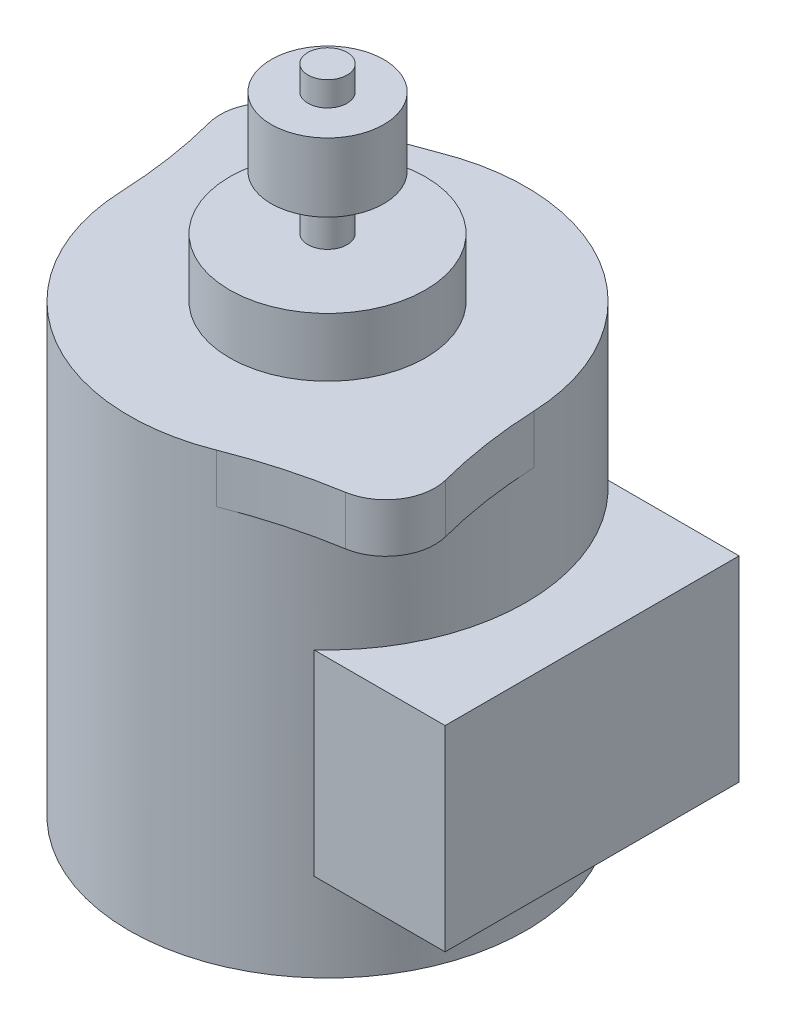
ISO-10303-21;
HEADER;
FILE_DESCRIPTION(('STEP AP214'),'2;1');
FILE_NAME('part.step','',(''),(''),'','','');
FILE_SCHEMA(('AUTOMOTIVE_DESIGN { 1 0 10303 214 1 1 1 1 }'));
ENDSEC;
DATA;
#1=APPLICATION_CONTEXT('core data for automotive mechanical design processes');
#2=APPLICATION_PROTOCOL_DEFINITION('international standard','automotive_design',2000,#1);
#3=PRODUCT_CONTEXT('',#1,'mechanical');
#4=PRODUCT('Part','Part','',(#3));
#5=PRODUCT_RELATED_PRODUCT_CATEGORY('part','',(#4));
#6=PRODUCT_DEFINITION_FORMATION('','',#4);
#7=PRODUCT_DEFINITION_CONTEXT('part definition',#1,'design');
#8=PRODUCT_DEFINITION('design','',#6,#7);
#9=PRODUCT_DEFINITION_SHAPE('','',#8);
#10=(LENGTH_UNIT() NAMED_UNIT(*) SI_UNIT(.MILLI.,.METRE.));
#11=(NAMED_UNIT(*) PLANE_ANGLE_UNIT() SI_UNIT($,.RADIAN.));
#12=(NAMED_UNIT(*) SI_UNIT($,.STERADIAN.) SOLID_ANGLE_UNIT());
#13=UNCERTAINTY_MEASURE_WITH_UNIT(LENGTH_MEASURE(1.E-05),#10,'distance_accuracy_value','');
#14=(GEOMETRIC_REPRESENTATION_CONTEXT(3) GLOBAL_UNCERTAINTY_ASSIGNED_CONTEXT((#13)) GLOBAL_UNIT_ASSIGNED_CONTEXT((#10,
#11,#12)) REPRESENTATION_CONTEXT('',''));
#15=CARTESIAN_POINT('',(0.,0.,0.));
#16=DIRECTION('',(0.,0.,1.));
#17=DIRECTION('',(1.,0.,0.));
#18=AXIS2_PLACEMENT_3D('',#15,#16,#17);
#19=CARTESIAN_POINT('',(0.,13.3,0.));
#20=DIRECTION('',(0.,-1.,0.));
#21=DIRECTION('',(0.,0.,-1.));
#22=AXIS2_PLACEMENT_3D('',#19,#20,#21);
#23=CYLINDRICAL_SURFACE('',#22,0.4);
#24=CARTESIAN_POINT('',(0.,10.3,0.));
#25=DIRECTION('',(0.,1.,0.));
#26=DIRECTION('',(0.,0.,1.));
#27=AXIS2_PLACEMENT_3D('',#24,#25,#26);
#28=CIRCLE('',#27,0.4);
#29=CARTESIAN_POINT('',(0.,10.3,0.4));
#30=VERTEX_POINT('',#29);
#31=EDGE_CURVE('E42',#30,#30,#28,.T.);
#32=ORIENTED_EDGE('',*,*,#31,.T.);
#33=EDGE_LOOP('',(#32));
#34=FACE_BOUND('',#33,.T.);
#35=CARTESIAN_POINT('',(0.,11.4,0.));
#36=DIRECTION('',(0.,1.,0.));
#37=DIRECTION('',(0.,0.,1.));
#38=AXIS2_PLACEMENT_3D('',#35,#36,#37);
#39=CIRCLE('',#38,0.4);
#40=CARTESIAN_POINT('',(0.,11.4,0.4));
#41=VERTEX_POINT('',#40);
#42=EDGE_CURVE('E11',#41,#41,#39,.T.);
#43=ORIENTED_EDGE('',*,*,#42,.F.);
#44=EDGE_LOOP('',(#43));
#45=FACE_BOUND('',#44,.T.);
#46=ADVANCED_FACE('F34',(#34,#45),#23,.T.);
#47=CARTESIAN_POINT('',(0.,8.1,0.));
#48=DIRECTION('',(0.,-1.,0.));
#49=DIRECTION('',(0.,0.,-1.));
#50=AXIS2_PLACEMENT_3D('',#47,#48,#49);
#51=CYLINDRICAL_SURFACE('',#50,4.05);
#52=DIRECTION('',(0.,-1.,0.));
#53=VECTOR('',#52,1.);
#54=CARTESIAN_POINT('',(2.72075357208256,8.1,3.));
#55=LINE('',#54,#53);
#56=CARTESIAN_POINT('',(2.72075357208256,5.8,3.));
#57=VERTEX_POINT('',#56);
#58=CARTESIAN_POINT('',(2.72075357208256,1.8,3.));
#59=VERTEX_POINT('',#58);
#60=EDGE_CURVE('E149',#57,#59,#55,.T.);
#61=ORIENTED_EDGE('',*,*,#60,.F.);
#62=CARTESIAN_POINT('',(0.,5.8,0.));
#63=DIRECTION('',(0.,1.,0.));
#64=DIRECTION('',(0.,0.,1.));
#65=AXIS2_PLACEMENT_3D('',#62,#63,#64);
#66=CIRCLE('',#65,4.05);
#67=CARTESIAN_POINT('',(2.72075357208256,5.8,-3.));
#68=VERTEX_POINT('',#67);
#69=EDGE_CURVE('E135',#68,#57,#66,.F.);
#70=ORIENTED_EDGE('',*,*,#69,.F.);
#71=DIRECTION('',(0.,-1.,0.));
#72=VECTOR('',#71,1.);
#73=CARTESIAN_POINT('',(2.72075357208256,8.1,-3.));
#74=LINE('',#73,#72);
#75=CARTESIAN_POINT('',(2.72075357208256,1.8,-3.));
#76=VERTEX_POINT('',#75);
#77=EDGE_CURVE('E125',#76,#68,#74,.F.);
#78=ORIENTED_EDGE('',*,*,#77,.F.);
#79=CARTESIAN_POINT('',(0.,1.8,0.));
#80=DIRECTION('',(0.,-1.,0.));
#81=DIRECTION('',(0.,0.,-1.));
#82=AXIS2_PLACEMENT_3D('',#79,#80,#81);
#83=CIRCLE('',#82,4.05);
#84=EDGE_CURVE('E144',#59,#76,#83,.F.);
#85=ORIENTED_EDGE('',*,*,#84,.F.);
#86=EDGE_LOOP('',(#61,#70,#78,#85));
#87=FACE_BOUND('',#86,.T.);
#88=CARTESIAN_POINT('',(0.,8.1,0.));
#89=DIRECTION('',(0.,1.,0.));
#90=DIRECTION('',(0.,0.,1.));
#91=AXIS2_PLACEMENT_3D('',#88,#89,#90);
#92=CIRCLE('',#91,4.05);
#93=CARTESIAN_POINT('',(1.49315454505589,8.1,3.76470310975234));
#94=VERTEX_POINT('',#93);
#95=CARTESIAN_POINT('',(4.04654809253663,8.1,-0.167178152843471));
#96=VERTEX_POINT('',#95);
#97=EDGE_CURVE('E192',#94,#96,#92,.T.);
#98=ORIENTED_EDGE('',*,*,#97,.F.);
#99=DIRECTION('',(0.,-1.,0.));
#100=VECTOR('',#99,1.);
#101=CARTESIAN_POINT('',(1.49315454505589,8.1,3.76470310975234));
#102=LINE('',#101,#100);
#103=CARTESIAN_POINT('',(1.49315454505589,9.1,3.76470310975234));
#104=VERTEX_POINT('',#103);
#105=EDGE_CURVE('E210',#94,#104,#102,.F.);
#106=ORIENTED_EDGE('',*,*,#105,.T.);
#107=CARTESIAN_POINT('',(0.,9.1,0.));
#108=DIRECTION('',(0.,1.,0.));
#109=DIRECTION('',(0.,0.,1.));
#110=AXIS2_PLACEMENT_3D('',#107,#108,#109);
#111=CIRCLE('',#110,4.05);
#112=CARTESIAN_POINT('',(-4.04654809253663,9.1,0.167178152843468));
#113=VERTEX_POINT('',#112);
#114=EDGE_CURVE('E178',#113,#104,#111,.T.);
#115=ORIENTED_EDGE('',*,*,#114,.F.);
#116=DIRECTION('',(0.,-1.,0.));
#117=VECTOR('',#116,1.);
#118=CARTESIAN_POINT('',(-4.04654809253663,8.1,0.167178152843468));
#119=LINE('',#118,#117);
#120=CARTESIAN_POINT('',(-4.04654809253663,8.1,0.167178152843468));
#121=VERTEX_POINT('',#120);
#122=EDGE_CURVE('E202',#113,#121,#119,.T.);
#123=ORIENTED_EDGE('',*,*,#122,.T.);
#124=CARTESIAN_POINT('',(-1.49315454505589,8.1,-3.76470310975234));
#125=VERTEX_POINT('',#124);
#126=EDGE_CURVE('E195',#125,#121,#92,.T.);
#127=ORIENTED_EDGE('',*,*,#126,.F.);
#128=DIRECTION('',(0.,-1.,0.));
#129=VECTOR('',#128,1.);
#130=CARTESIAN_POINT('',(-1.49315454505589,8.1,-3.76470310975234));
#131=LINE('',#130,#129);
#132=CARTESIAN_POINT('',(-1.49315454505589,9.1,-3.76470310975234));
#133=VERTEX_POINT('',#132);
#134=EDGE_CURVE('E205',#125,#133,#131,.F.);
#135=ORIENTED_EDGE('',*,*,#134,.T.);
#136=CARTESIAN_POINT('',(0.,9.1,0.));
#137=DIRECTION('',(0.,1.,0.));
#138=DIRECTION('',(0.,0.,1.));
#139=AXIS2_PLACEMENT_3D('',#136,#137,#138);
#140=CIRCLE('',#139,4.05);
#141=CARTESIAN_POINT('',(4.04654809253663,9.1,-0.167178152843471));
#142=VERTEX_POINT('',#141);
#143=EDGE_CURVE('E185',#142,#133,#140,.T.);
#144=ORIENTED_EDGE('',*,*,#143,.F.);
#145=DIRECTION('',(0.,-1.,0.));
#146=VECTOR('',#145,1.);
#147=CARTESIAN_POINT('',(4.04654809253663,8.1,-0.167178152843471));
#148=LINE('',#147,#146);
#149=EDGE_CURVE('E207',#142,#96,#148,.T.);
#150=ORIENTED_EDGE('',*,*,#149,.T.);
#151=EDGE_LOOP('',(#98,#106,#115,#123,#127,#135,#144,#150));
#152=FACE_BOUND('',#151,.T.);
#153=CARTESIAN_POINT('',(0.,0.,0.));
#154=DIRECTION('',(0.,1.,0.));
#155=DIRECTION('',(0.,0.,1.));
#156=AXIS2_PLACEMENT_3D('',#153,#154,#155);
#157=CIRCLE('',#156,4.05);
#158=CARTESIAN_POINT('',(0.,0.,4.05));
#159=VERTEX_POINT('',#158);
#160=EDGE_CURVE('E188',#159,#159,#157,.T.);
#161=ORIENTED_EDGE('',*,*,#160,.T.);
#162=EDGE_LOOP('',(#161));
#163=FACE_BOUND('',#162,.T.);
#164=ADVANCED_FACE('F147',(#87,#152,#163),#51,.T.);
#165=CARTESIAN_POINT('',(0.,0.,0.));
#166=DIRECTION('',(0.,1.,0.));
#167=DIRECTION('',(0.,0.,1.));
#168=AXIS2_PLACEMENT_3D('',#165,#166,#167);
#169=PLANE('',#168);
#170=ORIENTED_EDGE('',*,*,#160,.F.);
#171=EDGE_LOOP('',(#170));
#172=FACE_BOUND('',#171,.T.);
#173=ADVANCED_FACE('F267',(#172),#169,.F.);
#174=CARTESIAN_POINT('',(-1.69830790008948,8.1,-1.10289404590543));
#175=DIRECTION('',(0.,1.,0.));
#176=DIRECTION('',(0.,0.,1.));
#177=AXIS2_PLACEMENT_3D('',#174,#175,#176);
#178=PLANE('',#177);
#179=CARTESIAN_POINT('',(3.39661580017897,8.1,2.20578809181086));
#180=DIRECTION('',(0.,1.,0.));
#181=DIRECTION('',(0.,0.,1.));
#182=AXIS2_PLACEMENT_3D('',#179,#180,#181);
#183=CIRCLE('',#182,1.);
#184=CARTESIAN_POINT('',(3.55873762660569,8.1,3.1925588419834));
#185=VERTEX_POINT('',#184);
#186=CARTESIAN_POINT('',(4.36401662418379,8.1,1.95253792751715));
#187=VERTEX_POINT('',#186);
#188=EDGE_CURVE('E179',#185,#187,#183,.T.);
#189=ORIENTED_EDGE('',*,*,#188,.F.);
#190=CARTESIAN_POINT('',(5.17995589087291,8.1,13.0602663437087));
#191=DIRECTION('',(0.,1.,0.));
#192=DIRECTION('',(0.,0.,1.));
#193=AXIS2_PLACEMENT_3D('',#190,#191,#192);
#194=CIRCLE('',#193,10.);
#195=EDGE_CURVE('E216',#185,#94,#194,.T.);
#196=ORIENTED_EDGE('',*,*,#195,.T.);
#197=ORIENTED_EDGE('',*,*,#97,.T.);
#198=CARTESIAN_POINT('',(14.038024864232,8.1,-0.579963715419942));
#199=DIRECTION('',(0.,1.,0.));
#200=DIRECTION('',(0.,0.,1.));
#201=AXIS2_PLACEMENT_3D('',#198,#199,#200);
#202=CIRCLE('',#201,10.);
#203=EDGE_CURVE('E221',#96,#187,#202,.T.);
#204=ORIENTED_EDGE('',*,*,#203,.T.);
#205=EDGE_LOOP('',(#189,#196,#197,#204));
#206=FACE_BOUND('',#205,.T.);
#207=ADVANCED_FACE('F427',(#206),#178,.F.);
#208=CARTESIAN_POINT('',(-3.39661580017897,9.1,-2.20578809181086));
#209=DIRECTION('',(0.,-1.,0.));
#210=DIRECTION('',(0.,0.,-1.));
#211=AXIS2_PLACEMENT_3D('',#208,#209,#210);
#212=CYLINDRICAL_SURFACE('',#211,1.);
#213=CARTESIAN_POINT('',(-3.39661580017897,9.1,-2.20578809181086));
#214=DIRECTION('',(0.,1.,0.));
#215=DIRECTION('',(0.,0.,1.));
#216=AXIS2_PLACEMENT_3D('',#213,#214,#215);
#217=CIRCLE('',#216,1.);
#218=CARTESIAN_POINT('',(-3.55873762660569,9.1,-3.1925588419834));
#219=VERTEX_POINT('',#218);
#220=CARTESIAN_POINT('',(-4.36401662418379,9.1,-1.95253792751716));
#221=VERTEX_POINT('',#220);
#222=EDGE_CURVE('E176',#219,#221,#217,.T.);
#223=ORIENTED_EDGE('',*,*,#222,.F.);
#224=DIRECTION('',(0.,-1.,0.));
#225=VECTOR('',#224,1.);
#226=CARTESIAN_POINT('',(-3.55873762660569,9.1,-3.1925588419834));
#227=LINE('',#226,#225);
#228=CARTESIAN_POINT('',(-3.55873762660569,8.1,-3.1925588419834));
#229=VERTEX_POINT('',#228);
#230=EDGE_CURVE('E213',#219,#229,#227,.T.);
#231=ORIENTED_EDGE('',*,*,#230,.T.);
#232=CARTESIAN_POINT('',(-3.39661580017897,8.1,-2.20578809181086));
#233=DIRECTION('',(0.,1.,0.));
#234=DIRECTION('',(0.,0.,1.));
#235=AXIS2_PLACEMENT_3D('',#232,#233,#234);
#236=CIRCLE('',#235,1.);
#237=CARTESIAN_POINT('',(-4.36401662418379,8.1,-1.95253792751716));
#238=VERTEX_POINT('',#237);
#239=EDGE_CURVE('E172',#229,#238,#236,.T.);
#240=ORIENTED_EDGE('',*,*,#239,.T.);
#241=DIRECTION('',(0.,-1.,0.));
#242=VECTOR('',#241,1.);
#243=CARTESIAN_POINT('',(-4.36401662418379,9.1,-1.95253792751716));
#244=LINE('',#243,#242);
#245=EDGE_CURVE('E57',#238,#221,#244,.F.);
#246=ORIENTED_EDGE('',*,*,#245,.T.);
#247=EDGE_LOOP('',(#223,#231,#240,#246));
#248=FACE_BOUND('',#247,.T.);
#249=ADVANCED_FACE('F433',(#248),#212,.T.);
#250=CARTESIAN_POINT('',(3.39661580017897,9.1,2.20578809181086));
#251=DIRECTION('',(0.,-1.,0.));
#252=DIRECTION('',(0.,0.,-1.));
#253=AXIS2_PLACEMENT_3D('',#250,#251,#252);
#254=CYLINDRICAL_SURFACE('',#253,1.);
#255=CARTESIAN_POINT('',(3.39661580017897,9.1,2.20578809181086));
#256=DIRECTION('',(0.,1.,0.));
#257=DIRECTION('',(0.,0.,1.));
#258=AXIS2_PLACEMENT_3D('',#255,#256,#257);
#259=CIRCLE('',#258,1.);
#260=CARTESIAN_POINT('',(3.55873762660569,9.1,3.1925588419834));
#261=VERTEX_POINT('',#260);
#262=CARTESIAN_POINT('',(4.36401662418379,9.1,1.95253792751715));
#263=VERTEX_POINT('',#262);
#264=EDGE_CURVE('E182',#261,#263,#259,.T.);
#265=ORIENTED_EDGE('',*,*,#264,.F.);
#266=DIRECTION('',(0.,-1.,0.));
#267=VECTOR('',#266,1.);
#268=CARTESIAN_POINT('',(3.55873762660569,9.1,3.1925588419834));
#269=LINE('',#268,#267);
#270=EDGE_CURVE('E199',#261,#185,#269,.T.);
#271=ORIENTED_EDGE('',*,*,#270,.T.);
#272=ORIENTED_EDGE('',*,*,#188,.T.);
#273=DIRECTION('',(0.,-1.,0.));
#274=VECTOR('',#273,1.);
#275=CARTESIAN_POINT('',(4.36401662418379,9.1,1.95253792751715));
#276=LINE('',#275,#274);
#277=EDGE_CURVE('E194',#187,#263,#276,.F.);
#278=ORIENTED_EDGE('',*,*,#277,.T.);
#279=EDGE_LOOP('',(#265,#271,#272,#278));
#280=FACE_BOUND('',#279,.T.);
#281=ADVANCED_FACE('F378',(#280),#254,.T.);
#282=CARTESIAN_POINT('',(-1.69830790008948,9.1,-1.10289404590543));
#283=DIRECTION('',(0.,1.,0.));
#284=DIRECTION('',(0.,0.,1.));
#285=AXIS2_PLACEMENT_3D('',#282,#283,#284);
#286=PLANE('',#285);
#287=CARTESIAN_POINT('',(0.,9.1,0.));
#288=DIRECTION('',(0.,1.,0.));
#289=DIRECTION('',(0.,0.,1.));
#290=AXIS2_PLACEMENT_3D('',#287,#288,#289);
#291=CIRCLE('',#290,2.);
#292=CARTESIAN_POINT('',(0.,9.1,2.));
#293=VERTEX_POINT('',#292);
#294=EDGE_CURVE('E169',#293,#293,#291,.T.);
#295=ORIENTED_EDGE('',*,*,#294,.F.);
#296=EDGE_LOOP('',(#295));
#297=FACE_BOUND('',#296,.T.);
#298=ORIENTED_EDGE('',*,*,#143,.T.);
#299=CARTESIAN_POINT('',(-5.17995589087291,9.1,-13.0602663437087));
#300=DIRECTION('',(0.,1.,0.));
#301=DIRECTION('',(0.,0.,1.));
#302=AXIS2_PLACEMENT_3D('',#299,#300,#301);
#303=CIRCLE('',#302,10.);
#304=EDGE_CURVE('E228',#133,#219,#303,.F.);
#305=ORIENTED_EDGE('',*,*,#304,.T.);
#306=ORIENTED_EDGE('',*,*,#222,.T.);
#307=CARTESIAN_POINT('',(-14.038024864232,9.1,0.579963715419932));
#308=DIRECTION('',(0.,1.,0.));
#309=DIRECTION('',(0.,0.,1.));
#310=AXIS2_PLACEMENT_3D('',#307,#308,#309);
#311=CIRCLE('',#310,10.);
#312=EDGE_CURVE('E175',#221,#113,#311,.F.);
#313=ORIENTED_EDGE('',*,*,#312,.T.);
#314=ORIENTED_EDGE('',*,*,#114,.T.);
#315=CARTESIAN_POINT('',(5.17995589087291,9.1,13.0602663437087));
#316=DIRECTION('',(0.,1.,0.));
#317=DIRECTION('',(0.,0.,1.));
#318=AXIS2_PLACEMENT_3D('',#315,#316,#317);
#319=CIRCLE('',#318,10.);
#320=EDGE_CURVE('E219',#104,#261,#319,.F.);
#321=ORIENTED_EDGE('',*,*,#320,.T.);
#322=ORIENTED_EDGE('',*,*,#264,.T.);
#323=CARTESIAN_POINT('',(14.038024864232,9.1,-0.579963715419942));
#324=DIRECTION('',(0.,1.,0.));
#325=DIRECTION('',(0.,0.,1.));
#326=AXIS2_PLACEMENT_3D('',#323,#324,#325);
#327=CIRCLE('',#326,10.);
#328=EDGE_CURVE('E223',#263,#142,#327,.F.);
#329=ORIENTED_EDGE('',*,*,#328,.T.);
#330=EDGE_LOOP('',(#298,#305,#306,#313,#314,#321,#322,#329));
#331=FACE_BOUND('',#330,.T.);
#332=ADVANCED_FACE('F372',(#297,#331),#286,.T.);
#333=ORIENTED_EDGE('',*,*,#239,.F.);
#334=CARTESIAN_POINT('',(-5.17995589087291,8.1,-13.0602663437087));
#335=DIRECTION('',(0.,1.,0.));
#336=DIRECTION('',(0.,0.,1.));
#337=AXIS2_PLACEMENT_3D('',#334,#335,#336);
#338=CIRCLE('',#337,10.);
#339=EDGE_CURVE('E225',#229,#125,#338,.T.);
#340=ORIENTED_EDGE('',*,*,#339,.T.);
#341=ORIENTED_EDGE('',*,*,#126,.T.);
#342=CARTESIAN_POINT('',(-14.038024864232,8.1,0.579963715419932));
#343=DIRECTION('',(0.,1.,0.));
#344=DIRECTION('',(0.,0.,1.));
#345=AXIS2_PLACEMENT_3D('',#342,#343,#344);
#346=CIRCLE('',#345,10.);
#347=EDGE_CURVE('E230',#121,#238,#346,.T.);
#348=ORIENTED_EDGE('',*,*,#347,.T.);
#349=EDGE_LOOP('',(#333,#340,#341,#348));
#350=FACE_BOUND('',#349,.T.);
#351=ADVANCED_FACE('F377',(#350),#178,.F.);
#352=CARTESIAN_POINT('',(5.17995589087291,8.1,13.0602663437087));
#353=DIRECTION('',(0.,1.,0.));
#354=DIRECTION('',(0.,0.,1.));
#355=AXIS2_PLACEMENT_3D('',#352,#353,#354);
#356=CYLINDRICAL_SURFACE('',#355,10.);
#357=ORIENTED_EDGE('',*,*,#320,.F.);
#358=ORIENTED_EDGE('',*,*,#105,.F.);
#359=ORIENTED_EDGE('',*,*,#195,.F.);
#360=ORIENTED_EDGE('',*,*,#270,.F.);
#361=EDGE_LOOP('',(#357,#358,#359,#360));
#362=FACE_BOUND('',#361,.T.);
#363=ADVANCED_FACE('F408',(#362),#356,.F.);
#364=CARTESIAN_POINT('',(14.038024864232,9.1,-0.579963715419942));
#365=DIRECTION('',(0.,1.,0.));
#366=DIRECTION('',(0.,0.,1.));
#367=AXIS2_PLACEMENT_3D('',#364,#365,#366);
#368=CYLINDRICAL_SURFACE('',#367,10.);
#369=ORIENTED_EDGE('',*,*,#328,.F.);
#370=ORIENTED_EDGE('',*,*,#277,.F.);
#371=ORIENTED_EDGE('',*,*,#203,.F.);
#372=ORIENTED_EDGE('',*,*,#149,.F.);
#373=EDGE_LOOP('',(#369,#370,#371,#372));
#374=FACE_BOUND('',#373,.T.);
#375=ADVANCED_FACE('F399',(#374),#368,.F.);
#376=CARTESIAN_POINT('',(-5.17995589087291,8.1,-13.0602663437087));
#377=DIRECTION('',(0.,1.,0.));
#378=DIRECTION('',(0.,0.,1.));
#379=AXIS2_PLACEMENT_3D('',#376,#377,#378);
#380=CYLINDRICAL_SURFACE('',#379,10.);
#381=ORIENTED_EDGE('',*,*,#304,.F.);
#382=ORIENTED_EDGE('',*,*,#134,.F.);
#383=ORIENTED_EDGE('',*,*,#339,.F.);
#384=ORIENTED_EDGE('',*,*,#230,.F.);
#385=EDGE_LOOP('',(#381,#382,#383,#384));
#386=FACE_BOUND('',#385,.T.);
#387=ADVANCED_FACE('F390',(#386),#380,.F.);
#388=CARTESIAN_POINT('',(-14.038024864232,9.1,0.579963715419932));
#389=DIRECTION('',(0.,1.,0.));
#390=DIRECTION('',(0.,0.,1.));
#391=AXIS2_PLACEMENT_3D('',#388,#389,#390);
#392=CYLINDRICAL_SURFACE('',#391,10.);
#393=ORIENTED_EDGE('',*,*,#312,.F.);
#394=ORIENTED_EDGE('',*,*,#245,.F.);
#395=ORIENTED_EDGE('',*,*,#347,.F.);
#396=ORIENTED_EDGE('',*,*,#122,.F.);
#397=EDGE_LOOP('',(#393,#394,#395,#396));
#398=FACE_BOUND('',#397,.T.);
#399=ADVANCED_FACE('F36',(#398),#392,.F.);
#400=CARTESIAN_POINT('',(0.,10.3,0.));
#401=DIRECTION('',(0.,-1.,0.));
#402=DIRECTION('',(0.,0.,-1.));
#403=AXIS2_PLACEMENT_3D('',#400,#401,#402);
#404=CYLINDRICAL_SURFACE('',#403,2.);
#405=CARTESIAN_POINT('',(0.,10.3,0.));
#406=DIRECTION('',(0.,1.,0.));
#407=DIRECTION('',(0.,0.,1.));
#408=AXIS2_PLACEMENT_3D('',#405,#406,#407);
#409=CIRCLE('',#408,2.);
#410=CARTESIAN_POINT('',(0.,10.3,2.));
#411=VERTEX_POINT('',#410);
#412=EDGE_CURVE('E166',#411,#411,#409,.T.);
#413=ORIENTED_EDGE('',*,*,#412,.F.);
#414=EDGE_LOOP('',(#413));
#415=FACE_BOUND('',#414,.T.);
#416=ORIENTED_EDGE('',*,*,#294,.T.);
#417=EDGE_LOOP('',(#416));
#418=FACE_BOUND('',#417,.T.);
#419=ADVANCED_FACE('F257',(#415,#418),#404,.T.);
#420=CARTESIAN_POINT('',(0.,10.3,0.));
#421=DIRECTION('',(0.,1.,0.));
#422=DIRECTION('',(0.,0.,1.));
#423=AXIS2_PLACEMENT_3D('',#420,#421,#422);
#424=PLANE('',#423);
#425=ORIENTED_EDGE('',*,*,#31,.F.);
#426=EDGE_LOOP('',(#425));
#427=FACE_BOUND('',#426,.T.);
#428=ORIENTED_EDGE('',*,*,#412,.T.);
#429=EDGE_LOOP('',(#428));
#430=FACE_BOUND('',#429,.T.);
#431=ADVANCED_FACE('F248',(#427,#430),#424,.T.);
#432=CARTESIAN_POINT('',(0.,11.4,0.));
#433=DIRECTION('',(0.,1.,0.));
#434=DIRECTION('',(0.,0.,1.));
#435=AXIS2_PLACEMENT_3D('',#432,#433,#434);
#436=CYLINDRICAL_SURFACE('',#435,1.15);
#437=CARTESIAN_POINT('',(0.,11.4,0.));
#438=DIRECTION('',(0.,1.,0.));
#439=DIRECTION('',(0.,0.,1.));
#440=AXIS2_PLACEMENT_3D('',#437,#438,#439);
#441=CIRCLE('',#440,1.15);
#442=CARTESIAN_POINT('',(0.,11.4,1.15));
#443=VERTEX_POINT('',#442);
#444=EDGE_CURVE('E155',#443,#443,#441,.T.);
#445=ORIENTED_EDGE('',*,*,#444,.T.);
#446=EDGE_LOOP('',(#445));
#447=FACE_BOUND('',#446,.T.);
#448=CARTESIAN_POINT('',(0.,12.8,0.));
#449=DIRECTION('',(0.,1.,0.));
#450=DIRECTION('',(0.,0.,1.));
#451=AXIS2_PLACEMENT_3D('',#448,#449,#450);
#452=CIRCLE('',#451,1.15);
#453=CARTESIAN_POINT('',(0.,12.8,1.15));
#454=VERTEX_POINT('',#453);
#455=EDGE_CURVE('E159',#454,#454,#452,.T.);
#456=ORIENTED_EDGE('',*,*,#455,.F.);
#457=EDGE_LOOP('',(#456));
#458=FACE_BOUND('',#457,.T.);
#459=ADVANCED_FACE('F246',(#447,#458),#436,.T.);
#460=CARTESIAN_POINT('',(0.,11.4,0.));
#461=DIRECTION('',(0.,1.,0.));
#462=DIRECTION('',(0.,0.,1.));
#463=AXIS2_PLACEMENT_3D('',#460,#461,#462);
#464=PLANE('',#463);
#465=ORIENTED_EDGE('',*,*,#42,.T.);
#466=EDGE_LOOP('',(#465));
#467=FACE_BOUND('',#466,.T.);
#468=ORIENTED_EDGE('',*,*,#444,.F.);
#469=EDGE_LOOP('',(#468));
#470=FACE_BOUND('',#469,.T.);
#471=ADVANCED_FACE('F242',(#467,#470),#464,.F.);
#472=CARTESIAN_POINT('',(0.,12.8,0.));
#473=DIRECTION('',(0.,1.,0.));
#474=DIRECTION('',(0.,0.,1.));
#475=AXIS2_PLACEMENT_3D('',#472,#473,#474);
#476=PLANE('',#475);
#477=CARTESIAN_POINT('',(0.,12.8,0.));
#478=DIRECTION('',(0.,1.,0.));
#479=DIRECTION('',(0.,0.,1.));
#480=AXIS2_PLACEMENT_3D('',#477,#478,#479);
#481=CIRCLE('',#480,0.4);
#482=CARTESIAN_POINT('',(0.,12.8,0.4));
#483=VERTEX_POINT('',#482);
#484=EDGE_CURVE('E158',#483,#483,#481,.T.);
#485=ORIENTED_EDGE('',*,*,#484,.F.);
#486=EDGE_LOOP('',(#485));
#487=FACE_BOUND('',#486,.T.);
#488=ORIENTED_EDGE('',*,*,#455,.T.);
#489=EDGE_LOOP('',(#488));
#490=FACE_BOUND('',#489,.T.);
#491=ADVANCED_FACE('F238',(#487,#490),#476,.T.);
#492=CARTESIAN_POINT('',(0.,13.3,0.));
#493=DIRECTION('',(0.,1.,0.));
#494=DIRECTION('',(0.,0.,1.));
#495=AXIS2_PLACEMENT_3D('',#492,#493,#494);
#496=PLANE('',#495);
#497=CARTESIAN_POINT('',(0.,13.3,0.));
#498=DIRECTION('',(0.,1.,0.));
#499=DIRECTION('',(0.,0.,1.));
#500=AXIS2_PLACEMENT_3D('',#497,#498,#499);
#501=CIRCLE('',#500,0.4);
#502=CARTESIAN_POINT('',(0.,13.3,0.4));
#503=VERTEX_POINT('',#502);
#504=EDGE_CURVE('E163',#503,#503,#501,.T.);
#505=ORIENTED_EDGE('',*,*,#504,.T.);
#506=EDGE_LOOP('',(#505));
#507=FACE_BOUND('',#506,.T.);
#508=ADVANCED_FACE('F241',(#507),#496,.T.);
#509=ORIENTED_EDGE('',*,*,#484,.T.);
#510=EDGE_LOOP('',(#509));
#511=FACE_BOUND('',#510,.T.);
#512=ORIENTED_EDGE('',*,*,#504,.F.);
#513=EDGE_LOOP('',(#512));
#514=FACE_BOUND('',#513,.T.);
#515=ADVANCED_FACE('F235',(#511,#514),#23,.T.);
#516=CARTESIAN_POINT('',(-4.39861580017897,5.8,3.));
#517=DIRECTION('',(0.,1.,0.));
#518=DIRECTION('',(0.,0.,1.));
#519=AXIS2_PLACEMENT_3D('',#516,#517,#518);
#520=PLANE('',#519);
#521=DIRECTION('',(1.,0.,0.));
#522=VECTOR('',#521,1.);
#523=CARTESIAN_POINT('',(-4.39861580017897,5.8,-3.));
#524=LINE('',#523,#522);
#525=CARTESIAN_POINT('',(5.4,5.8,-3.));
#526=VERTEX_POINT('',#525);
#527=EDGE_CURVE('E129',#68,#526,#524,.T.);
#528=ORIENTED_EDGE('',*,*,#527,.F.);
#529=ORIENTED_EDGE('',*,*,#69,.T.);
#530=DIRECTION('',(1.,0.,0.));
#531=VECTOR('',#530,1.);
#532=CARTESIAN_POINT('',(-4.39861580017897,5.8,3.));
#533=LINE('',#532,#531);
#534=CARTESIAN_POINT('',(5.4,5.8,3.));
#535=VERTEX_POINT('',#534);
#536=EDGE_CURVE('E143',#57,#535,#533,.T.);
#537=ORIENTED_EDGE('',*,*,#536,.T.);
#538=DIRECTION('',(0.,0.,1.));
#539=VECTOR('',#538,1.);
#540=CARTESIAN_POINT('',(5.4,5.8,3.));
#541=LINE('',#540,#539);
#542=EDGE_CURVE('E141',#526,#535,#541,.T.);
#543=ORIENTED_EDGE('',*,*,#542,.F.);
#544=EDGE_LOOP('',(#528,#529,#537,#543));
#545=FACE_BOUND('',#544,.T.);
#546=ADVANCED_FACE('F138',(#545),#520,.T.);
#547=CARTESIAN_POINT('',(5.4,0.,0.));
#548=DIRECTION('',(-1.,0.,0.));
#549=DIRECTION('',(0.,0.,1.));
#550=AXIS2_PLACEMENT_3D('',#547,#548,#549);
#551=PLANE('',#550);
#552=DIRECTION('',(0.,1.,0.));
#553=VECTOR('',#552,1.);
#554=CARTESIAN_POINT('',(5.4,1.8,-3.));
#555=LINE('',#554,#553);
#556=CARTESIAN_POINT('',(5.4,1.8,-3.));
#557=VERTEX_POINT('',#556);
#558=EDGE_CURVE('E162',#557,#526,#555,.T.);
#559=ORIENTED_EDGE('',*,*,#558,.T.);
#560=ORIENTED_EDGE('',*,*,#542,.T.);
#561=DIRECTION('',(0.,-1.,0.));
#562=VECTOR('',#561,1.);
#563=CARTESIAN_POINT('',(5.4,1.8,3.));
#564=LINE('',#563,#562);
#565=CARTESIAN_POINT('',(5.4,1.8,3.));
#566=VERTEX_POINT('',#565);
#567=EDGE_CURVE('E300',#535,#566,#564,.T.);
#568=ORIENTED_EDGE('',*,*,#567,.T.);
#569=DIRECTION('',(0.,0.,-1.));
#570=VECTOR('',#569,1.);
#571=CARTESIAN_POINT('',(5.4,1.8,3.));
#572=LINE('',#571,#570);
#573=EDGE_CURVE('E298',#566,#557,#572,.T.);
#574=ORIENTED_EDGE('',*,*,#573,.T.);
#575=EDGE_LOOP('',(#559,#560,#568,#574));
#576=FACE_BOUND('',#575,.T.);
#577=ADVANCED_FACE('F276',(#576),#551,.F.);
#578=CARTESIAN_POINT('',(-4.39861580017897,1.8,-3.));
#579=DIRECTION('',(0.,0.,-1.));
#580=DIRECTION('',(-1.,0.,0.));
#581=AXIS2_PLACEMENT_3D('',#578,#579,#580);
#582=PLANE('',#581);
#583=DIRECTION('',(1.,0.,0.));
#584=VECTOR('',#583,1.);
#585=CARTESIAN_POINT('',(-4.39861580017897,1.8,-3.));
#586=LINE('',#585,#584);
#587=EDGE_CURVE('E131',#76,#557,#586,.T.);
#588=ORIENTED_EDGE('',*,*,#587,.F.);
#589=ORIENTED_EDGE('',*,*,#77,.T.);
#590=ORIENTED_EDGE('',*,*,#527,.T.);
#591=ORIENTED_EDGE('',*,*,#558,.F.);
#592=EDGE_LOOP('',(#588,#589,#590,#591));
#593=FACE_BOUND('',#592,.T.);
#594=ADVANCED_FACE('F127',(#593),#582,.T.);
#595=CARTESIAN_POINT('',(-4.39861580017897,1.8,3.));
#596=DIRECTION('',(0.,0.,1.));
#597=DIRECTION('',(1.,0.,0.));
#598=AXIS2_PLACEMENT_3D('',#595,#596,#597);
#599=PLANE('',#598);
#600=ORIENTED_EDGE('',*,*,#536,.F.);
#601=ORIENTED_EDGE('',*,*,#60,.T.);
#602=DIRECTION('',(1.,0.,0.));
#603=VECTOR('',#602,1.);
#604=CARTESIAN_POINT('',(-4.39861580017897,1.8,3.));
#605=LINE('',#604,#603);
#606=EDGE_CURVE('E49',#59,#566,#605,.T.);
#607=ORIENTED_EDGE('',*,*,#606,.T.);
#608=ORIENTED_EDGE('',*,*,#567,.F.);
#609=EDGE_LOOP('',(#600,#601,#607,#608));
#610=FACE_BOUND('',#609,.T.);
#611=ADVANCED_FACE('F280',(#610),#599,.T.);
#612=CARTESIAN_POINT('',(-4.39861580017897,1.8,3.));
#613=DIRECTION('',(0.,-1.,0.));
#614=DIRECTION('',(0.,0.,-1.));
#615=AXIS2_PLACEMENT_3D('',#612,#613,#614);
#616=PLANE('',#615);
#617=ORIENTED_EDGE('',*,*,#606,.F.);
#618=ORIENTED_EDGE('',*,*,#84,.T.);
#619=ORIENTED_EDGE('',*,*,#587,.T.);
#620=ORIENTED_EDGE('',*,*,#573,.F.);
#621=EDGE_LOOP('',(#617,#618,#619,#620));
#622=FACE_BOUND('',#621,.T.);
#623=ADVANCED_FACE('F271',(#622),#616,.T.);
#624=CLOSED_SHELL('',(#46,#164,#173,#207,#249,#281,#332,#351,#363,#375,#387,#399,#419,#431,#459,
#471,#491,#508,#515,#546,#577,#594,#611,#623));
#625=MANIFOLD_SOLID_BREP('B2',#624);
#626=ADVANCED_BREP_SHAPE_REPRESENTATION('',(#18,#625),#14);
#627=SHAPE_DEFINITION_REPRESENTATION(#9,#626);
ENDSEC;
END-ISO-10303-21;
